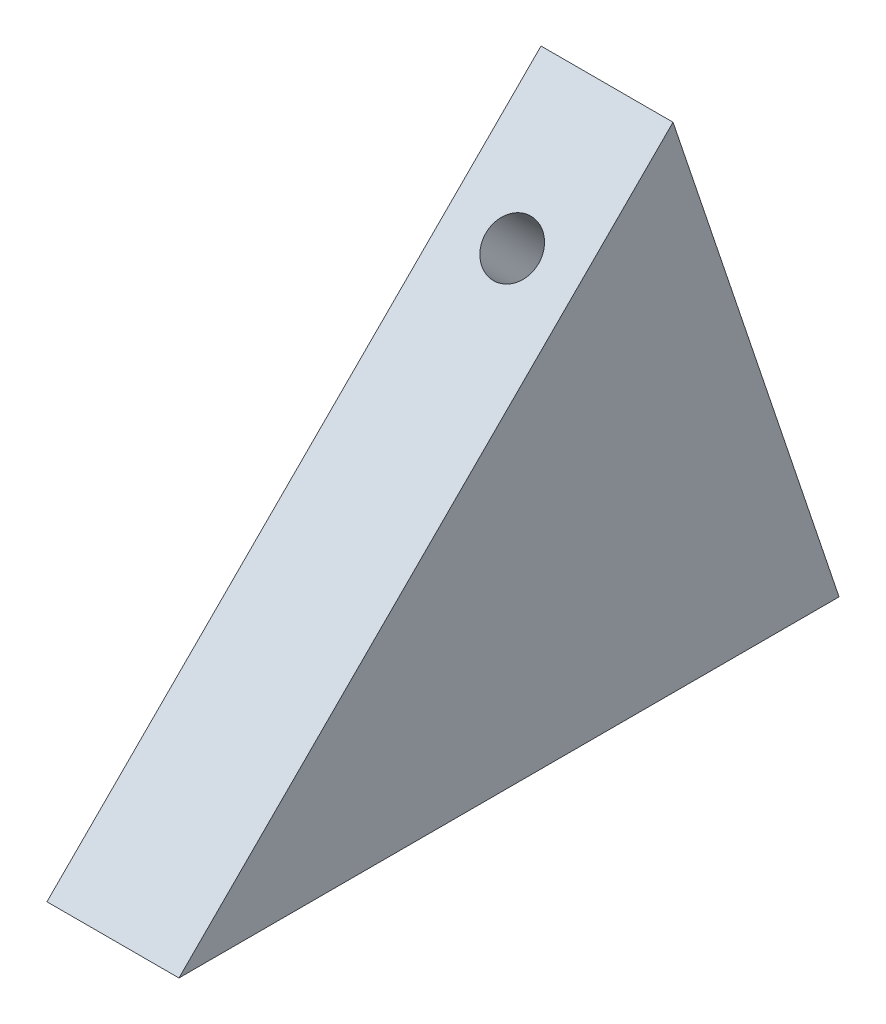
ISO-10303-21;
HEADER;
FILE_DESCRIPTION(('STEP AP214'),'2;1');
FILE_NAME('part.step','',(''),(''),'','','');
FILE_SCHEMA(('AUTOMOTIVE_DESIGN { 1 0 10303 214 1 1 1 1 }'));
ENDSEC;
DATA;
#1=APPLICATION_CONTEXT('core data for automotive mechanical design processes');
#2=APPLICATION_PROTOCOL_DEFINITION('international standard','automotive_design',2000,#1);
#3=PRODUCT_CONTEXT('',#1,'mechanical');
#4=PRODUCT('Part','Part','',(#3));
#5=PRODUCT_RELATED_PRODUCT_CATEGORY('part','',(#4));
#6=PRODUCT_DEFINITION_FORMATION('','',#4);
#7=PRODUCT_DEFINITION_CONTEXT('part definition',#1,'design');
#8=PRODUCT_DEFINITION('design','',#6,#7);
#9=PRODUCT_DEFINITION_SHAPE('','',#8);
#10=(LENGTH_UNIT() NAMED_UNIT(*) SI_UNIT(.MILLI.,.METRE.));
#11=(NAMED_UNIT(*) PLANE_ANGLE_UNIT() SI_UNIT($,.RADIAN.));
#12=(NAMED_UNIT(*) SI_UNIT($,.STERADIAN.) SOLID_ANGLE_UNIT());
#13=UNCERTAINTY_MEASURE_WITH_UNIT(LENGTH_MEASURE(1.E-05),#10,'distance_accuracy_value','');
#14=(GEOMETRIC_REPRESENTATION_CONTEXT(3) GLOBAL_UNCERTAINTY_ASSIGNED_CONTEXT((#13)) GLOBAL_UNIT_ASSIGNED_CONTEXT((#10,
#11,#12)) REPRESENTATION_CONTEXT('',''));
#15=CARTESIAN_POINT('',(0.,0.,0.));
#16=DIRECTION('',(0.,0.,1.));
#17=DIRECTION('',(1.,0.,0.));
#18=AXIS2_PLACEMENT_3D('',#15,#16,#17);
#19=CARTESIAN_POINT('',(10.,0.,-50.));
#20=DIRECTION('',(0.,1.,0.));
#21=DIRECTION('',(0.,0.,1.));
#22=AXIS2_PLACEMENT_3D('',#19,#20,#21);
#23=PLANE('',#22);
#24=CARTESIAN_POINT('',(5.,0.,-34.4777125458506));
#25=DIRECTION('',(0.,-1.,0.));
#26=DIRECTION('',(0.,0.,-1.));
#27=AXIS2_PLACEMENT_3D('',#24,#25,#26);
#28=CIRCLE('',#27,2.);
#29=CARTESIAN_POINT('',(5.,0.,-36.4777125458506));
#30=VERTEX_POINT('',#29);
#31=EDGE_CURVE('E93',#30,#30,#28,.T.);
#32=ORIENTED_EDGE('',*,*,#31,.F.);
#33=EDGE_LOOP('',(#32));
#34=FACE_BOUND('',#33,.T.);
#35=DIRECTION('',(0.,0.,-1.));
#36=VECTOR('',#35,1.);
#37=CARTESIAN_POINT('',(0.,0.,-50.));
#38=LINE('',#37,#36);
#39=CARTESIAN_POINT('',(0.,0.,0.));
#40=VERTEX_POINT('',#39);
#41=CARTESIAN_POINT('',(0.,0.,-50.));
#42=VERTEX_POINT('',#41);
#43=EDGE_CURVE('E86',#40,#42,#38,.T.);
#44=ORIENTED_EDGE('',*,*,#43,.T.);
#45=DIRECTION('',(-1.,0.,0.));
#46=VECTOR('',#45,1.);
#47=CARTESIAN_POINT('',(10.,0.,-50.));
#48=LINE('',#47,#46);
#49=CARTESIAN_POINT('',(10.,0.,-50.));
#50=VERTEX_POINT('',#49);
#51=EDGE_CURVE('E11',#50,#42,#48,.T.);
#52=ORIENTED_EDGE('',*,*,#51,.F.);
#53=DIRECTION('',(0.,0.,-1.));
#54=VECTOR('',#53,1.);
#55=CARTESIAN_POINT('',(10.,0.,-50.));
#56=LINE('',#55,#54);
#57=CARTESIAN_POINT('',(10.,0.,0.));
#58=VERTEX_POINT('',#57);
#59=EDGE_CURVE('E79',#58,#50,#56,.T.);
#60=ORIENTED_EDGE('',*,*,#59,.F.);
#61=DIRECTION('',(-1.,0.,0.));
#62=VECTOR('',#61,1.);
#63=CARTESIAN_POINT('',(10.,0.,0.));
#64=LINE('',#63,#62);
#65=EDGE_CURVE('E87',#58,#40,#64,.T.);
#66=ORIENTED_EDGE('',*,*,#65,.T.);
#67=EDGE_LOOP('',(#44,#52,#60,#66));
#68=FACE_BOUND('',#67,.T.);
#69=ADVANCED_FACE('F39',(#34,#68),#23,.F.);
#70=CARTESIAN_POINT('',(10.,37.4242305801553,-37.4242305801557));
#71=DIRECTION('',(0.,-0.318529817257856,0.947912841730545));
#72=DIRECTION('',(0.,-0.947912841730545,-0.318529817257856));
#73=AXIS2_PLACEMENT_3D('',#70,#71,#72);
#74=PLANE('',#73);
#75=DIRECTION('',(0.,0.947912841730545,0.318529817257856));
#76=VECTOR('',#75,1.);
#77=CARTESIAN_POINT('',(0.,37.4242305801553,-37.4242305801557));
#78=LINE('',#77,#76);
#79=CARTESIAN_POINT('',(0.,37.4242305801553,-37.4242305801557));
#80=VERTEX_POINT('',#79);
#81=EDGE_CURVE('E67',#42,#80,#78,.T.);
#82=ORIENTED_EDGE('',*,*,#81,.T.);
#83=DIRECTION('',(-1.,0.,0.));
#84=VECTOR('',#83,1.);
#85=CARTESIAN_POINT('',(10.,37.4242305801553,-37.4242305801557));
#86=LINE('',#85,#84);
#87=CARTESIAN_POINT('',(10.,37.4242305801553,-37.4242305801557));
#88=VERTEX_POINT('',#87);
#89=EDGE_CURVE('E47',#88,#80,#86,.T.);
#90=ORIENTED_EDGE('',*,*,#89,.F.);
#91=DIRECTION('',(0.,0.947912841730545,0.318529817257856));
#92=VECTOR('',#91,1.);
#93=CARTESIAN_POINT('',(10.,37.4242305801553,-37.4242305801557));
#94=LINE('',#93,#92);
#95=EDGE_CURVE('E75',#50,#88,#94,.T.);
#96=ORIENTED_EDGE('',*,*,#95,.F.);
#97=ORIENTED_EDGE('',*,*,#51,.T.);
#98=EDGE_LOOP('',(#82,#90,#96,#97));
#99=FACE_BOUND('',#98,.T.);
#100=ADVANCED_FACE('F76',(#99),#74,.F.);
#101=CARTESIAN_POINT('',(10.,0.,0.));
#102=DIRECTION('',(0.,-0.707106781186551,-0.707106781186544));
#103=DIRECTION('',(0.,0.707106781186544,-0.707106781186551));
#104=AXIS2_PLACEMENT_3D('',#101,#102,#103);
#105=PLANE('',#104);
#106=CARTESIAN_POINT('',(5.,30.2404838390806,-30.2404838390809));
#107=DIRECTION('',(0.,0.707106781186551,0.707106781186544));
#108=DIRECTION('',(0.,-0.707106781186544,0.707106781186551));
#109=AXIS2_PLACEMENT_3D('',#106,#107,#108);
#110=CIRCLE('',#109,2.);
#111=CARTESIAN_POINT('',(5.,28.8262702767075,-28.8262702767078));
#112=VERTEX_POINT('',#111);
#113=EDGE_CURVE('E123',#112,#112,#110,.T.);
#114=ORIENTED_EDGE('',*,*,#113,.F.);
#115=EDGE_LOOP('',(#114));
#116=FACE_BOUND('',#115,.T.);
#117=DIRECTION('',(0.,-0.707106781186544,0.707106781186551));
#118=VECTOR('',#117,1.);
#119=CARTESIAN_POINT('',(0.,0.,0.));
#120=LINE('',#119,#118);
#121=EDGE_CURVE('E72',#80,#40,#120,.T.);
#122=ORIENTED_EDGE('',*,*,#121,.T.);
#123=ORIENTED_EDGE('',*,*,#65,.F.);
#124=DIRECTION('',(0.,-0.707106781186544,0.707106781186551));
#125=VECTOR('',#124,1.);
#126=CARTESIAN_POINT('',(10.,0.,0.));
#127=LINE('',#126,#125);
#128=EDGE_CURVE('E55',#88,#58,#127,.T.);
#129=ORIENTED_EDGE('',*,*,#128,.F.);
#130=ORIENTED_EDGE('',*,*,#89,.T.);
#131=EDGE_LOOP('',(#122,#123,#129,#130));
#132=FACE_BOUND('',#131,.T.);
#133=ADVANCED_FACE('F98',(#116,#132),#105,.F.);
#134=CARTESIAN_POINT('',(10.,0.,0.));
#135=DIRECTION('',(1.,0.,0.));
#136=DIRECTION('',(0.,0.,-1.));
#137=AXIS2_PLACEMENT_3D('',#134,#135,#136);
#138=PLANE('',#137);
#139=ORIENTED_EDGE('',*,*,#59,.T.);
#140=ORIENTED_EDGE('',*,*,#95,.T.);
#141=ORIENTED_EDGE('',*,*,#128,.T.);
#142=EDGE_LOOP('',(#139,#140,#141));
#143=FACE_BOUND('',#142,.T.);
#144=ADVANCED_FACE('F82',(#143),#138,.T.);
#145=CARTESIAN_POINT('',(0.,0.,0.));
#146=DIRECTION('',(1.,0.,0.));
#147=DIRECTION('',(0.,0.,-1.));
#148=AXIS2_PLACEMENT_3D('',#145,#146,#147);
#149=PLANE('',#148);
#150=ORIENTED_EDGE('',*,*,#43,.F.);
#151=ORIENTED_EDGE('',*,*,#121,.F.);
#152=ORIENTED_EDGE('',*,*,#81,.F.);
#153=EDGE_LOOP('',(#150,#151,#152));
#154=FACE_BOUND('',#153,.T.);
#155=ADVANCED_FACE('F99',(#154),#149,.F.);
#156=CARTESIAN_POINT('',(5.,10.,-34.4777125458506));
#157=DIRECTION('',(0.,-1.,0.));
#158=DIRECTION('',(0.,0.,-1.));
#159=AXIS2_PLACEMENT_3D('',#156,#157,#158);
#160=CYLINDRICAL_SURFACE('',#159,2.);
#161=CARTESIAN_POINT('',(5.,10.,-34.4777125458506));
#162=DIRECTION('',(0.,-1.,0.));
#163=DIRECTION('',(0.,0.,-1.));
#164=AXIS2_PLACEMENT_3D('',#161,#162,#163);
#165=CIRCLE('',#164,2.);
#166=CARTESIAN_POINT('',(5.,10.,-36.4777125458506));
#167=VERTEX_POINT('',#166);
#168=EDGE_CURVE('E89',#167,#167,#165,.T.);
#169=ORIENTED_EDGE('',*,*,#168,.F.);
#170=EDGE_LOOP('',(#169));
#171=FACE_BOUND('',#170,.T.);
#172=ORIENTED_EDGE('',*,*,#31,.T.);
#173=EDGE_LOOP('',(#172));
#174=FACE_BOUND('',#173,.T.);
#175=ADVANCED_FACE('F101',(#171,#174),#160,.F.);
#176=CARTESIAN_POINT('',(5.,10.,-34.4777125458506));
#177=DIRECTION('',(0.,-1.,0.));
#178=DIRECTION('',(0.,0.,-1.));
#179=AXIS2_PLACEMENT_3D('',#176,#177,#178);
#180=PLANE('',#179);
#181=ORIENTED_EDGE('',*,*,#168,.T.);
#182=EDGE_LOOP('',(#181));
#183=FACE_BOUND('',#182,.T.);
#184=ADVANCED_FACE('F108',(#183),#180,.T.);
#185=CARTESIAN_POINT('',(5.,23.1694160272151,-37.3115516509463));
#186=DIRECTION('',(0.,0.707106781186551,0.707106781186544));
#187=DIRECTION('',(0.,-0.707106781186544,0.707106781186551));
#188=AXIS2_PLACEMENT_3D('',#185,#186,#187);
#189=CYLINDRICAL_SURFACE('',#188,2.);
#190=CARTESIAN_POINT('',(5.,23.1694160272151,-37.3115516509463));
#191=DIRECTION('',(0.,0.707106781186551,0.707106781186544));
#192=DIRECTION('',(0.,-0.707106781186544,0.707106781186551));
#193=AXIS2_PLACEMENT_3D('',#190,#191,#192);
#194=CIRCLE('',#193,2.);
#195=CARTESIAN_POINT('',(5.,21.755202464842,-35.8973380885732));
#196=VERTEX_POINT('',#195);
#197=EDGE_CURVE('E120',#196,#196,#194,.T.);
#198=ORIENTED_EDGE('',*,*,#197,.F.);
#199=EDGE_LOOP('',(#198));
#200=FACE_BOUND('',#199,.T.);
#201=ORIENTED_EDGE('',*,*,#113,.T.);
#202=EDGE_LOOP('',(#201));
#203=FACE_BOUND('',#202,.T.);
#204=ADVANCED_FACE('F129',(#200,#203),#189,.F.);
#205=CARTESIAN_POINT('',(5.,23.1694160272151,-37.3115516509463));
#206=DIRECTION('',(0.,0.707106781186551,0.707106781186544));
#207=DIRECTION('',(0.,-0.707106781186544,0.707106781186551));
#208=AXIS2_PLACEMENT_3D('',#205,#206,#207);
#209=PLANE('',#208);
#210=ORIENTED_EDGE('',*,*,#197,.T.);
#211=EDGE_LOOP('',(#210));
#212=FACE_BOUND('',#211,.T.);
#213=ADVANCED_FACE('F146',(#212),#209,.T.);
#214=CLOSED_SHELL('',(#69,#100,#133,#144,#155,#175,#184,#204,#213));
#215=MANIFOLD_SOLID_BREP('B2',#214);
#216=ADVANCED_BREP_SHAPE_REPRESENTATION('',(#18,#215),#14);
#217=SHAPE_DEFINITION_REPRESENTATION(#9,#216);
ENDSEC;
END-ISO-10303-21;
